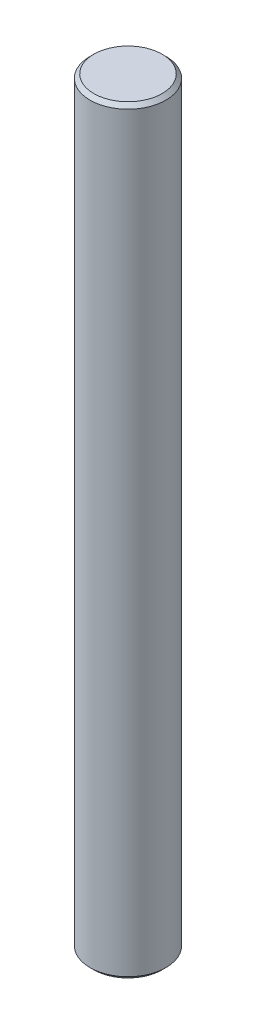
ISO-10303-21;
HEADER;
FILE_DESCRIPTION(('STEP AP214'),'2;1');
FILE_NAME('part.step','',(''),(''),'','','');
FILE_SCHEMA(('AUTOMOTIVE_DESIGN { 1 0 10303 214 1 1 1 1 }'));
ENDSEC;
DATA;
#1=APPLICATION_CONTEXT('core data for automotive mechanical design processes');
#2=APPLICATION_PROTOCOL_DEFINITION('international standard','automotive_design',2000,#1);
#3=PRODUCT_CONTEXT('',#1,'mechanical');
#4=PRODUCT('Part','Part','',(#3));
#5=PRODUCT_RELATED_PRODUCT_CATEGORY('part','',(#4));
#6=PRODUCT_DEFINITION_FORMATION('','',#4);
#7=PRODUCT_DEFINITION_CONTEXT('part definition',#1,'design');
#8=PRODUCT_DEFINITION('design','',#6,#7);
#9=PRODUCT_DEFINITION_SHAPE('','',#8);
#10=(LENGTH_UNIT() NAMED_UNIT(*) SI_UNIT(.MILLI.,.METRE.));
#11=(NAMED_UNIT(*) PLANE_ANGLE_UNIT() SI_UNIT($,.RADIAN.));
#12=(NAMED_UNIT(*) SI_UNIT($,.STERADIAN.) SOLID_ANGLE_UNIT());
#13=UNCERTAINTY_MEASURE_WITH_UNIT(LENGTH_MEASURE(1.E-05),#10,'distance_accuracy_value','');
#14=(GEOMETRIC_REPRESENTATION_CONTEXT(3) GLOBAL_UNCERTAINTY_ASSIGNED_CONTEXT((#13)) GLOBAL_UNIT_ASSIGNED_CONTEXT((#10,
#11,#12)) REPRESENTATION_CONTEXT('',''));
#15=CARTESIAN_POINT('',(0.,0.,0.));
#16=DIRECTION('',(0.,0.,1.));
#17=DIRECTION('',(1.,0.,0.));
#18=AXIS2_PLACEMENT_3D('',#15,#16,#17);
#19=CARTESIAN_POINT('',(0.,50.,0.));
#20=DIRECTION('',(0.,-1.,0.));
#21=DIRECTION('',(0.,0.,-1.));
#22=AXIS2_PLACEMENT_3D('',#19,#20,#21);
#23=CYLINDRICAL_SURFACE('',#22,2.5);
#24=CARTESIAN_POINT('',(0.,0.25,0.));
#25=DIRECTION('',(0.,1.,0.));
#26=DIRECTION('',(0.,0.,1.));
#27=AXIS2_PLACEMENT_3D('',#24,#25,#26);
#28=CIRCLE('',#27,2.5);
#29=CARTESIAN_POINT('',(0.,0.25,2.5));
#30=VERTEX_POINT('',#29);
#31=EDGE_CURVE('E42',#30,#30,#28,.T.);
#32=ORIENTED_EDGE('',*,*,#31,.T.);
#33=EDGE_LOOP('',(#32));
#34=FACE_BOUND('',#33,.T.);
#35=CARTESIAN_POINT('',(0.,49.75,0.));
#36=DIRECTION('',(0.,1.,0.));
#37=DIRECTION('',(0.,0.,1.));
#38=AXIS2_PLACEMENT_3D('',#35,#36,#37);
#39=CIRCLE('',#38,2.5);
#40=CARTESIAN_POINT('',(0.,49.75,2.5));
#41=VERTEX_POINT('',#40);
#42=EDGE_CURVE('E46',#41,#41,#39,.F.);
#43=ORIENTED_EDGE('',*,*,#42,.T.);
#44=EDGE_LOOP('',(#43));
#45=FACE_BOUND('',#44,.T.);
#46=ADVANCED_FACE('F31',(#34,#45),#23,.T.);
#47=CARTESIAN_POINT('',(0.,50.,0.));
#48=DIRECTION('',(0.,1.,0.));
#49=DIRECTION('',(0.,0.,1.));
#50=AXIS2_PLACEMENT_3D('',#47,#48,#49);
#51=PLANE('',#50);
#52=CARTESIAN_POINT('',(0.,50.,0.));
#53=DIRECTION('',(0.,1.,0.));
#54=DIRECTION('',(0.,0.,1.));
#55=AXIS2_PLACEMENT_3D('',#52,#53,#54);
#56=CIRCLE('',#55,2.25000000000001);
#57=CARTESIAN_POINT('',(0.,50.,2.25000000000001));
#58=VERTEX_POINT('',#57);
#59=EDGE_CURVE('E10',#58,#58,#56,.T.);
#60=ORIENTED_EDGE('',*,*,#59,.T.);
#61=EDGE_LOOP('',(#60));
#62=FACE_BOUND('',#61,.T.);
#63=ADVANCED_FACE('F62',(#62),#51,.T.);
#64=CARTESIAN_POINT('',(0.,0.,0.));
#65=DIRECTION('',(0.,1.,0.));
#66=DIRECTION('',(0.,0.,1.));
#67=AXIS2_PLACEMENT_3D('',#64,#65,#66);
#68=PLANE('',#67);
#69=CARTESIAN_POINT('',(0.,0.,0.));
#70=DIRECTION('',(0.,1.,0.));
#71=DIRECTION('',(0.,0.,1.));
#72=AXIS2_PLACEMENT_3D('',#69,#70,#71);
#73=CIRCLE('',#72,2.25);
#74=CARTESIAN_POINT('',(0.,0.,2.25));
#75=VERTEX_POINT('',#74);
#76=EDGE_CURVE('E38',#75,#75,#73,.F.);
#77=ORIENTED_EDGE('',*,*,#76,.T.);
#78=EDGE_LOOP('',(#77));
#79=FACE_BOUND('',#78,.T.);
#80=ADVANCED_FACE('F59',(#79),#68,.F.);
#81=CARTESIAN_POINT('',(0.,0.25,0.));
#82=DIRECTION('',(0.,1.,0.));
#83=DIRECTION('',(0.,0.,1.));
#84=AXIS2_PLACEMENT_3D('',#81,#82,#83);
#85=CONICAL_SURFACE('',#84,2.5,0.785398163397445);
#86=ORIENTED_EDGE('',*,*,#76,.F.);
#87=EDGE_LOOP('',(#86));
#88=FACE_BOUND('',#87,.T.);
#89=ORIENTED_EDGE('',*,*,#31,.F.);
#90=EDGE_LOOP('',(#89));
#91=FACE_BOUND('',#90,.T.);
#92=ADVANCED_FACE('F55',(#88,#91),#85,.T.);
#93=CARTESIAN_POINT('',(0.,50.,0.));
#94=DIRECTION('',(0.,-1.,0.));
#95=DIRECTION('',(0.,0.,-1.));
#96=AXIS2_PLACEMENT_3D('',#93,#94,#95);
#97=CONICAL_SURFACE('',#96,2.25000000000001,0.785398163397445);
#98=ORIENTED_EDGE('',*,*,#42,.F.);
#99=EDGE_LOOP('',(#98));
#100=FACE_BOUND('',#99,.T.);
#101=ORIENTED_EDGE('',*,*,#59,.F.);
#102=EDGE_LOOP('',(#101));
#103=FACE_BOUND('',#102,.T.);
#104=ADVANCED_FACE('F33',(#100,#103),#97,.T.);
#105=CLOSED_SHELL('',(#46,#63,#80,#92,#104));
#106=MANIFOLD_SOLID_BREP('B2',#105);
#107=ADVANCED_BREP_SHAPE_REPRESENTATION('',(#18,#106),#14);
#108=SHAPE_DEFINITION_REPRESENTATION(#9,#107);
ENDSEC;
END-ISO-10303-21;
